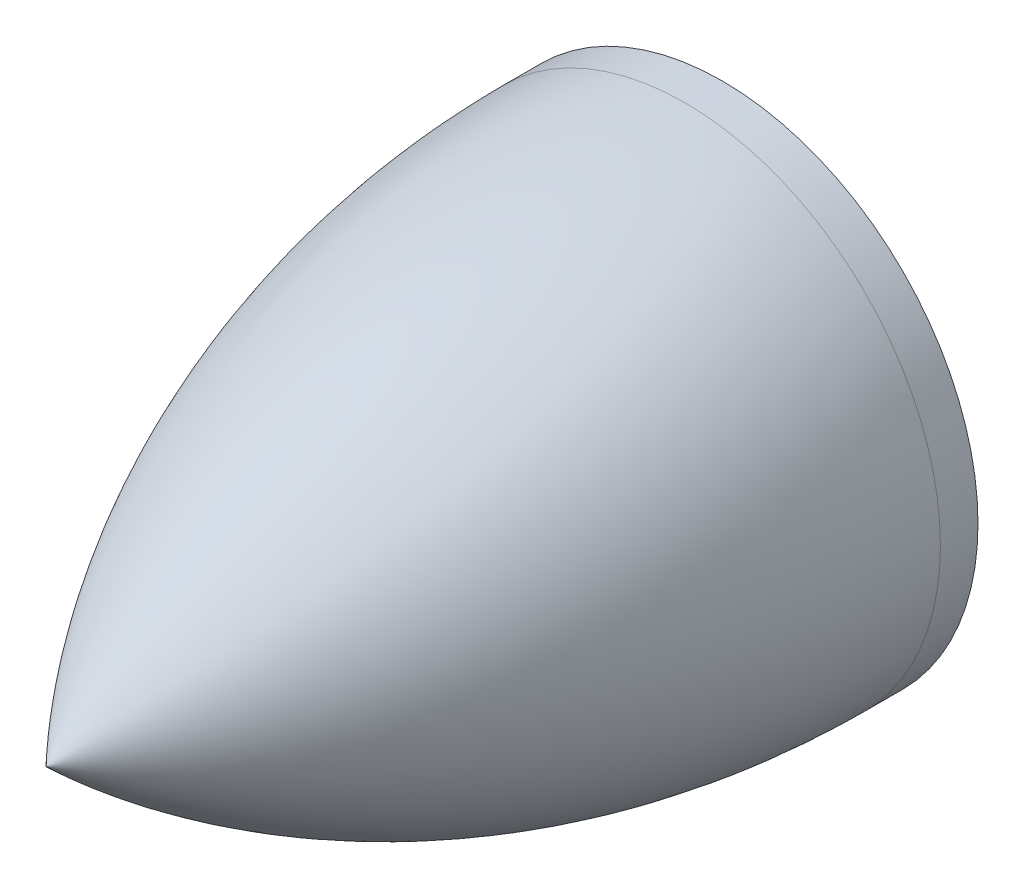
ISO-10303-21;
HEADER;
FILE_DESCRIPTION(('STEP AP214'),'2;1');
FILE_NAME('part.step','',(''),(''),'','','');
FILE_SCHEMA(('AUTOMOTIVE_DESIGN { 1 0 10303 214 1 1 1 1 }'));
ENDSEC;
DATA;
#1=APPLICATION_CONTEXT('core data for automotive mechanical design processes');
#2=APPLICATION_PROTOCOL_DEFINITION('international standard','automotive_design',2000,#1);
#3=PRODUCT_CONTEXT('',#1,'mechanical');
#4=PRODUCT('Part','Part','',(#3));
#5=PRODUCT_RELATED_PRODUCT_CATEGORY('part','',(#4));
#6=PRODUCT_DEFINITION_FORMATION('','',#4);
#7=PRODUCT_DEFINITION_CONTEXT('part definition',#1,'design');
#8=PRODUCT_DEFINITION('design','',#6,#7);
#9=PRODUCT_DEFINITION_SHAPE('','',#8);
#10=(LENGTH_UNIT() NAMED_UNIT(*) SI_UNIT(.MILLI.,.METRE.));
#11=(NAMED_UNIT(*) PLANE_ANGLE_UNIT() SI_UNIT($,.RADIAN.));
#12=(NAMED_UNIT(*) SI_UNIT($,.STERADIAN.) SOLID_ANGLE_UNIT());
#13=UNCERTAINTY_MEASURE_WITH_UNIT(LENGTH_MEASURE(1.E-05),#10,'distance_accuracy_value','');
#14=(GEOMETRIC_REPRESENTATION_CONTEXT(3) GLOBAL_UNCERTAINTY_ASSIGNED_CONTEXT((#13)) GLOBAL_UNIT_ASSIGNED_CONTEXT((#10,
#11,#12)) REPRESENTATION_CONTEXT('',''));
#15=CARTESIAN_POINT('',(0.,0.,0.));
#16=DIRECTION('',(0.,0.,1.));
#17=DIRECTION('',(1.,0.,0.));
#18=AXIS2_PLACEMENT_3D('',#15,#16,#17);
#19=CARTESIAN_POINT('',(-178.5,178.5,0.));
#20=DIRECTION('',(0.,-1.,0.));
#21=DIRECTION('',(1.,0.,0.));
#22=AXIS2_PLACEMENT_3D('',#19,#20,#21);
#23=CIRCLE('',#22,241.5);
#24=TRIMMED_CURVE('',#23,(PARAMETER_VALUE(-0.739017879013918)),
(PARAMETER_VALUE(0.739017879013918)),.T.,.PARAMETER.);
#25=CARTESIAN_POINT('',(0.,178.5,0.));
#26=DIRECTION('',(0.,0.,1.));
#27=AXIS1_PLACEMENT('',#25,#26);
#28=SURFACE_OF_REVOLUTION('',#24,#27);
#29=CARTESIAN_POINT('',(0.,178.5,162.665300540712));
#30=VERTEX_POINT('',#29);
#31=VERTEX_LOOP('',#30);
#32=FACE_BOUND('',#31,.T.);
#33=CARTESIAN_POINT('',(0.,178.5,0.));
#34=DIRECTION('',(0.,0.,1.));
#35=DIRECTION('',(1.,0.,0.));
#36=AXIS2_PLACEMENT_3D('',#33,#34,#35);
#37=CIRCLE('',#36,63.);
#38=CARTESIAN_POINT('',(63.,178.5,0.));
#39=VERTEX_POINT('',#38);
#40=EDGE_CURVE('E12',#39,#39,#37,.T.);
#41=ORIENTED_EDGE('',*,*,#40,.F.);
#42=EDGE_LOOP('',(#41));
#43=FACE_BOUND('',#42,.T.);
#44=ADVANCED_FACE('F44',(#32,#43),#28,.F.);
#45=CARTESIAN_POINT('',(0.,0.,0.));
#46=DIRECTION('',(0.,0.,1.));
#47=DIRECTION('',(1.,0.,0.));
#48=AXIS2_PLACEMENT_3D('',#45,#46,#47);
#49=PLANE('',#48);
#50=CARTESIAN_POINT('',(-3.88578058618805E-13,178.500000000004,0.));
#51=DIRECTION('',(0.,0.,-0.999999999999975));
#52=DIRECTION('',(-1.00000000000001,0.,0.));
#53=AXIS2_PLACEMENT_3D('',#50,#51,#52);
#54=CIRCLE('',#53,66.25);
#55=CARTESIAN_POINT('',(66.2499999999996,178.500000000004,0.));
#56=VERTEX_POINT('',#55);
#57=EDGE_CURVE('E67',#56,#56,#54,.T.);
#58=ORIENTED_EDGE('',*,*,#57,.T.);
#59=EDGE_LOOP('',(#58));
#60=FACE_BOUND('',#59,.T.);
#61=ORIENTED_EDGE('',*,*,#40,.T.);
#62=EDGE_LOOP('',(#61));
#63=FACE_BOUND('',#62,.T.);
#64=ADVANCED_FACE('F87',(#60,#63),#49,.F.);
#65=CARTESIAN_POINT('',(-3.88578058618805E-13,178.500000000004,-10.));
#66=DIRECTION('',(0.,0.,1.));
#67=DIRECTION('',(1.,0.,0.));
#68=AXIS2_PLACEMENT_3D('',#65,#66,#67);
#69=CYLINDRICAL_SURFACE('',#68,66.25);
#70=CARTESIAN_POINT('',(-3.88578058618805E-13,178.500000000004,-10.));
#71=DIRECTION('',(0.,0.,-0.999999999999975));
#72=DIRECTION('',(-1.00000000000001,0.,0.));
#73=AXIS2_PLACEMENT_3D('',#70,#71,#72);
#74=CIRCLE('',#73,66.25);
#75=CARTESIAN_POINT('',(66.2499999999996,178.500000000004,-10.));
#76=VERTEX_POINT('',#75);
#77=EDGE_CURVE('E66',#76,#76,#74,.T.);
#78=CARTESIAN_POINT('',(66.2499999999996,178.500000000004,-10.));
#79=CARTESIAN_POINT('',(66.2499999999996,178.500000000004,-9.89583333333333));
#80=CARTESIAN_POINT('',(66.2499999999996,178.500000000004,-9.79166666666667));
#81=CARTESIAN_POINT('',(66.2499999999996,178.500000000004,-9.58333333333333));
#82=CARTESIAN_POINT('',(66.2499999999996,178.500000000004,-9.47916666666667));
#83=CARTESIAN_POINT('',(66.2499999999996,178.500000000004,-9.27083333333333));
#84=CARTESIAN_POINT('',(66.2499999999996,178.500000000004,-9.16666666666667));
#85=CARTESIAN_POINT('',(66.2499999999996,178.500000000004,-8.95833333333333));
#86=CARTESIAN_POINT('',(66.2499999999996,178.500000000004,-8.85416666666667));
#87=CARTESIAN_POINT('',(66.2499999999996,178.500000000004,-8.64583333333333));
#88=CARTESIAN_POINT('',(66.2499999999996,178.500000000004,-8.54166666666667));
#89=CARTESIAN_POINT('',(66.2499999999996,178.500000000004,-8.33333333333333));
#90=CARTESIAN_POINT('',(66.2499999999996,178.500000000004,-8.22916666666667));
#91=CARTESIAN_POINT('',(66.2499999999996,178.500000000004,-8.02083333333333));
#92=CARTESIAN_POINT('',(66.2499999999996,178.500000000004,-7.91666666666667));
#93=CARTESIAN_POINT('',(66.2499999999996,178.500000000004,-7.70833333333333));
#94=CARTESIAN_POINT('',(66.2499999999996,178.500000000004,-7.60416666666667));
#95=CARTESIAN_POINT('',(66.2499999999996,178.500000000004,-7.39583333333333));
#96=CARTESIAN_POINT('',(66.2499999999996,178.500000000004,-7.29166666666667));
#97=CARTESIAN_POINT('',(66.2499999999996,178.500000000004,-7.08333333333333));
#98=CARTESIAN_POINT('',(66.2499999999996,178.500000000004,-6.97916666666667));
#99=CARTESIAN_POINT('',(66.2499999999996,178.500000000004,-6.77083333333333));
#100=CARTESIAN_POINT('',(66.2499999999996,178.500000000004,-6.66666666666667));
#101=CARTESIAN_POINT('',(66.2499999999996,178.500000000004,-6.45833333333333));
#102=CARTESIAN_POINT('',(66.2499999999996,178.500000000004,-6.35416666666667));
#103=CARTESIAN_POINT('',(66.2499999999996,178.500000000004,-6.14583333333333));
#104=CARTESIAN_POINT('',(66.2499999999996,178.500000000004,-6.04166666666667));
#105=CARTESIAN_POINT('',(66.2499999999996,178.500000000004,-5.83333333333333));
#106=CARTESIAN_POINT('',(66.2499999999996,178.500000000004,-5.72916666666667));
#107=CARTESIAN_POINT('',(66.2499999999996,178.500000000004,-5.52083333333333));
#108=CARTESIAN_POINT('',(66.2499999999996,178.500000000004,-5.41666666666667));
#109=CARTESIAN_POINT('',(66.2499999999996,178.500000000004,-5.20833333333333));
#110=CARTESIAN_POINT('',(66.2499999999996,178.500000000004,-5.10416666666667));
#111=CARTESIAN_POINT('',(66.2499999999996,178.500000000004,-4.89583333333333));
#112=CARTESIAN_POINT('',(66.2499999999996,178.500000000004,-4.79166666666666));
#113=CARTESIAN_POINT('',(66.2499999999996,178.500000000004,-4.58333333333333));
#114=CARTESIAN_POINT('',(66.2499999999996,178.500000000004,-4.47916666666666));
#115=CARTESIAN_POINT('',(66.2499999999996,178.500000000004,-4.27083333333333));
#116=CARTESIAN_POINT('',(66.2499999999996,178.500000000004,-4.16666666666667));
#117=CARTESIAN_POINT('',(66.2499999999996,178.500000000004,-3.95833333333333));
#118=CARTESIAN_POINT('',(66.2499999999996,178.500000000004,-3.85416666666667));
#119=CARTESIAN_POINT('',(66.2499999999996,178.500000000004,-3.64583333333333));
#120=CARTESIAN_POINT('',(66.2499999999996,178.500000000004,-3.54166666666666));
#121=CARTESIAN_POINT('',(66.2499999999996,178.500000000004,-3.33333333333333));
#122=CARTESIAN_POINT('',(66.2499999999996,178.500000000004,-3.22916666666666));
#123=CARTESIAN_POINT('',(66.2499999999996,178.500000000004,-3.02083333333333));
#124=CARTESIAN_POINT('',(66.2499999999996,178.500000000004,-2.91666666666667));
#125=CARTESIAN_POINT('',(66.2499999999996,178.500000000004,-2.70833333333333));
#126=CARTESIAN_POINT('',(66.2499999999996,178.500000000004,-2.60416666666666));
#127=CARTESIAN_POINT('',(66.2499999999996,178.500000000004,-2.39583333333333));
#128=CARTESIAN_POINT('',(66.2499999999996,178.500000000004,-2.29166666666666));
#129=CARTESIAN_POINT('',(66.2499999999996,178.500000000004,-2.08333333333333));
#130=CARTESIAN_POINT('',(66.2499999999996,178.500000000004,-1.97916666666667));
#131=CARTESIAN_POINT('',(66.2499999999996,178.500000000004,-1.77083333333333));
#132=CARTESIAN_POINT('',(66.2499999999996,178.500000000004,-1.66666666666666));
#133=CARTESIAN_POINT('',(66.2499999999996,178.500000000004,-1.45833333333333));
#134=CARTESIAN_POINT('',(66.2499999999996,178.500000000004,-1.35416666666667));
#135=CARTESIAN_POINT('',(66.2499999999996,178.500000000004,-1.14583333333333));
#136=CARTESIAN_POINT('',(66.2499999999996,178.500000000004,-1.04166666666667));
#137=CARTESIAN_POINT('',(66.2499999999996,178.500000000004,-0.833333333333332));
#138=CARTESIAN_POINT('',(66.2499999999996,178.500000000004,-0.729166666666666));
#139=CARTESIAN_POINT('',(66.2499999999996,178.500000000004,-0.520833333333332));
#140=CARTESIAN_POINT('',(66.2499999999996,178.500000000004,-0.416666666666665));
#141=CARTESIAN_POINT('',(66.2499999999996,178.500000000004,-0.208333333333332));
#142=CARTESIAN_POINT('',(66.2499999999996,178.500000000004,-0.104166666666665));
#143=CARTESIAN_POINT('',(66.2499999999996,178.500000000004,0.));
#144=B_SPLINE_CURVE_WITH_KNOTS('',3,(#78,#79,#80,#81,#82,#83,#84,#85,#86,#87,#88,#89,#90,#91,
#92,#93,#94,#95,#96,#97,#98,#99,#100,#101,#102,#103,#104,#105,#106,#107,#108,#109,#110,#111,
#112,#113,#114,#115,#116,#117,#118,#119,#120,#121,#122,#123,#124,#125,#126,#127,#128,#129,#130,
#131,#132,#133,#134,#135,#136,#137,#138,#139,#140,#141,#142,#143),.UNSPECIFIED.,.F.,.F.,(4,2,2,
2,2,2,2,2,2,2,2,2,2,2,2,2,2,2,2,2,2,2,2,2,2,2,2,2,2,2,2,2,4),(0.,0.3125,0.625000000000001,
0.937500000000001,1.25,1.5625,1.875,2.1875,2.5,2.8125,3.125,3.4375,3.75,4.0625,4.375,4.6875,5.,
5.3125,5.625,5.9375,6.25,6.5625,6.875,7.1875,7.5,7.8125,8.125,8.4375,8.75,9.0625,9.375,9.6875,
10.),.UNSPECIFIED.);
#145=EDGE_CURVE('BSEAM79',#76,#56,#144,.T.);
#146=ORIENTED_EDGE('',*,*,#77,.T.);
#147=ORIENTED_EDGE('',*,*,#57,.F.);
#148=ORIENTED_EDGE('',*,*,#145,.T.);
#149=ORIENTED_EDGE('',*,*,#145,.F.);
#150=EDGE_LOOP('',(#146,#148,#147,#149));
#151=FACE_BOUND('',#150,.T.);
#152=ADVANCED_FACE('F79',(#151),#69,.F.);
#153=CARTESIAN_POINT('',(-3.88578058618805E-13,178.500000000004,-10.));
#154=DIRECTION('',(0.,0.,1.));
#155=DIRECTION('',(1.,0.,0.));
#156=AXIS2_PLACEMENT_3D('',#153,#154,#155);
#157=CYLINDRICAL_SURFACE('',#156,68.);
#158=CARTESIAN_POINT('',(-3.88578058618805E-13,178.500000000004,-10.));
#159=DIRECTION('',(0.,0.,-0.999999999999975));
#160=DIRECTION('',(-1.00000000000001,0.,0.));
#161=AXIS2_PLACEMENT_3D('',#158,#159,#160);
#162=CIRCLE('',#161,68.);
#163=CARTESIAN_POINT('',(67.9999999999996,178.500000000004,-10.));
#164=VERTEX_POINT('',#163);
#165=EDGE_CURVE('E51',#164,#164,#162,.T.);
#166=CARTESIAN_POINT('',(-3.88578058618805E-13,178.500000000004,0.));
#167=DIRECTION('',(0.,0.,-0.999999999999975));
#168=DIRECTION('',(-1.00000000000001,0.,0.));
#169=AXIS2_PLACEMENT_3D('',#166,#167,#168);
#170=CIRCLE('',#169,68.);
#171=CARTESIAN_POINT('',(67.9999999999996,178.500000000004,0.));
#172=VERTEX_POINT('',#171);
#173=EDGE_CURVE('E64',#172,#172,#170,.T.);
#174=CARTESIAN_POINT('',(67.9999999999996,178.500000000004,-10.));
#175=CARTESIAN_POINT('',(67.9999999999996,178.500000000004,-9.89583333333333));
#176=CARTESIAN_POINT('',(67.9999999999996,178.500000000004,-9.79166666666667));
#177=CARTESIAN_POINT('',(67.9999999999996,178.500000000004,-9.58333333333333));
#178=CARTESIAN_POINT('',(67.9999999999996,178.500000000004,-9.47916666666667));
#179=CARTESIAN_POINT('',(67.9999999999996,178.500000000004,-9.27083333333333));
#180=CARTESIAN_POINT('',(67.9999999999996,178.500000000004,-9.16666666666667));
#181=CARTESIAN_POINT('',(67.9999999999996,178.500000000004,-8.95833333333333));
#182=CARTESIAN_POINT('',(67.9999999999996,178.500000000004,-8.85416666666667));
#183=CARTESIAN_POINT('',(67.9999999999996,178.500000000004,-8.64583333333333));
#184=CARTESIAN_POINT('',(67.9999999999996,178.500000000004,-8.54166666666667));
#185=CARTESIAN_POINT('',(67.9999999999996,178.500000000004,-8.33333333333333));
#186=CARTESIAN_POINT('',(67.9999999999996,178.500000000004,-8.22916666666667));
#187=CARTESIAN_POINT('',(67.9999999999996,178.500000000004,-8.02083333333333));
#188=CARTESIAN_POINT('',(67.9999999999996,178.500000000004,-7.91666666666667));
#189=CARTESIAN_POINT('',(67.9999999999996,178.500000000004,-7.70833333333333));
#190=CARTESIAN_POINT('',(67.9999999999996,178.500000000004,-7.60416666666667));
#191=CARTESIAN_POINT('',(67.9999999999996,178.500000000004,-7.39583333333333));
#192=CARTESIAN_POINT('',(67.9999999999996,178.500000000004,-7.29166666666667));
#193=CARTESIAN_POINT('',(67.9999999999996,178.500000000004,-7.08333333333333));
#194=CARTESIAN_POINT('',(67.9999999999996,178.500000000004,-6.97916666666667));
#195=CARTESIAN_POINT('',(67.9999999999996,178.500000000004,-6.77083333333333));
#196=CARTESIAN_POINT('',(67.9999999999996,178.500000000004,-6.66666666666667));
#197=CARTESIAN_POINT('',(67.9999999999996,178.500000000004,-6.45833333333333));
#198=CARTESIAN_POINT('',(67.9999999999996,178.500000000004,-6.35416666666667));
#199=CARTESIAN_POINT('',(67.9999999999996,178.500000000004,-6.14583333333333));
#200=CARTESIAN_POINT('',(67.9999999999996,178.500000000004,-6.04166666666667));
#201=CARTESIAN_POINT('',(67.9999999999996,178.500000000004,-5.83333333333333));
#202=CARTESIAN_POINT('',(67.9999999999996,178.500000000004,-5.72916666666667));
#203=CARTESIAN_POINT('',(67.9999999999996,178.500000000004,-5.52083333333333));
#204=CARTESIAN_POINT('',(67.9999999999996,178.500000000004,-5.41666666666667));
#205=CARTESIAN_POINT('',(67.9999999999996,178.500000000004,-5.20833333333333));
#206=CARTESIAN_POINT('',(67.9999999999996,178.500000000004,-5.10416666666667));
#207=CARTESIAN_POINT('',(67.9999999999996,178.500000000004,-4.89583333333333));
#208=CARTESIAN_POINT('',(67.9999999999996,178.500000000004,-4.79166666666666));
#209=CARTESIAN_POINT('',(67.9999999999996,178.500000000004,-4.58333333333333));
#210=CARTESIAN_POINT('',(67.9999999999996,178.500000000004,-4.47916666666666));
#211=CARTESIAN_POINT('',(67.9999999999996,178.500000000004,-4.27083333333333));
#212=CARTESIAN_POINT('',(67.9999999999996,178.500000000004,-4.16666666666667));
#213=CARTESIAN_POINT('',(67.9999999999996,178.500000000004,-3.95833333333333));
#214=CARTESIAN_POINT('',(67.9999999999996,178.500000000004,-3.85416666666667));
#215=CARTESIAN_POINT('',(67.9999999999996,178.500000000004,-3.64583333333333));
#216=CARTESIAN_POINT('',(67.9999999999996,178.500000000004,-3.54166666666666));
#217=CARTESIAN_POINT('',(67.9999999999996,178.500000000004,-3.33333333333333));
#218=CARTESIAN_POINT('',(67.9999999999996,178.500000000004,-3.22916666666666));
#219=CARTESIAN_POINT('',(67.9999999999996,178.500000000004,-3.02083333333333));
#220=CARTESIAN_POINT('',(67.9999999999996,178.500000000004,-2.91666666666667));
#221=CARTESIAN_POINT('',(67.9999999999996,178.500000000004,-2.70833333333333));
#222=CARTESIAN_POINT('',(67.9999999999996,178.500000000004,-2.60416666666666));
#223=CARTESIAN_POINT('',(67.9999999999996,178.500000000004,-2.39583333333333));
#224=CARTESIAN_POINT('',(67.9999999999996,178.500000000004,-2.29166666666666));
#225=CARTESIAN_POINT('',(67.9999999999996,178.500000000004,-2.08333333333333));
#226=CARTESIAN_POINT('',(67.9999999999996,178.500000000004,-1.97916666666667));
#227=CARTESIAN_POINT('',(67.9999999999996,178.500000000004,-1.77083333333333));
#228=CARTESIAN_POINT('',(67.9999999999996,178.500000000004,-1.66666666666666));
#229=CARTESIAN_POINT('',(67.9999999999996,178.500000000004,-1.45833333333333));
#230=CARTESIAN_POINT('',(67.9999999999996,178.500000000004,-1.35416666666667));
#231=CARTESIAN_POINT('',(67.9999999999996,178.500000000004,-1.14583333333333));
#232=CARTESIAN_POINT('',(67.9999999999996,178.500000000004,-1.04166666666667));
#233=CARTESIAN_POINT('',(67.9999999999996,178.500000000004,-0.833333333333332));
#234=CARTESIAN_POINT('',(67.9999999999996,178.500000000004,-0.729166666666666));
#235=CARTESIAN_POINT('',(67.9999999999996,178.500000000004,-0.520833333333332));
#236=CARTESIAN_POINT('',(67.9999999999996,178.500000000004,-0.416666666666665));
#237=CARTESIAN_POINT('',(67.9999999999996,178.500000000004,-0.208333333333332));
#238=CARTESIAN_POINT('',(67.9999999999996,178.500000000004,-0.104166666666665));
#239=CARTESIAN_POINT('',(67.9999999999996,178.500000000004,0.));
#240=B_SPLINE_CURVE_WITH_KNOTS('',3,(#174,#175,#176,#177,#178,#179,#180,#181,#182,#183,#184,
#185,#186,#187,#188,#189,#190,#191,#192,#193,#194,#195,#196,#197,#198,#199,#200,#201,#202,#203,
#204,#205,#206,#207,#208,#209,#210,#211,#212,#213,#214,#215,#216,#217,#218,#219,#220,#221,#222,
#223,#224,#225,#226,#227,#228,#229,#230,#231,#232,#233,#234,#235,#236,#237,#238,#239),
.UNSPECIFIED.,.F.,.F.,(4,2,2,2,2,2,2,2,2,2,2,2,2,2,2,2,2,2,2,2,2,2,2,2,2,2,2,2,2,2,2,2,4),(0.,
0.3125,0.625000000000001,0.937500000000001,1.25,1.5625,1.875,2.1875,2.5,2.8125,3.125,3.4375,
3.75,4.0625,4.375,4.6875,5.,5.3125,5.625,5.9375,6.25,6.5625,6.875,7.1875,7.5,7.8125,8.125,
8.4375,8.75,9.0625,9.375,9.6875,10.),.UNSPECIFIED.);
#241=EDGE_CURVE('BSEAM77',#164,#172,#240,.T.);
#242=ORIENTED_EDGE('',*,*,#165,.F.);
#243=ORIENTED_EDGE('',*,*,#173,.T.);
#244=ORIENTED_EDGE('',*,*,#241,.T.);
#245=ORIENTED_EDGE('',*,*,#241,.F.);
#246=EDGE_LOOP('',(#242,#244,#243,#245));
#247=FACE_BOUND('',#246,.T.);
#248=ADVANCED_FACE('F77',(#247),#157,.T.);
#249=CARTESIAN_POINT('',(0.,0.,-10.));
#250=DIRECTION('',(0.,0.,-0.999999999999975));
#251=DIRECTION('',(-1.00000000000001,0.,0.));
#252=AXIS2_PLACEMENT_3D('',#249,#250,#251);
#253=PLANE('',#252);
#254=ORIENTED_EDGE('',*,*,#77,.F.);
#255=EDGE_LOOP('',(#254));
#256=FACE_BOUND('',#255,.T.);
#257=ORIENTED_EDGE('',*,*,#165,.T.);
#258=EDGE_LOOP('',(#257));
#259=FACE_BOUND('',#258,.T.);
#260=ADVANCED_FACE('F60',(#256,#259),#253,.T.);
#261=CARTESIAN_POINT('',(-178.5,178.5,0.));
#262=DIRECTION('',(0.,-1.,0.));
#263=DIRECTION('',(1.,0.,0.));
#264=AXIS2_PLACEMENT_3D('',#261,#262,#263);
#265=CIRCLE('',#264,246.5);
#266=TRIMMED_CURVE('',#265,(PARAMETER_VALUE(-0.76101275422473)),
(PARAMETER_VALUE(0.76101275422473)),.T.,.PARAMETER.);
#267=CARTESIAN_POINT('',(0.,178.5,0.));
#268=DIRECTION('',(0.,0.,1.));
#269=AXIS1_PLACEMENT('',#267,#268);
#270=SURFACE_OF_REVOLUTION('',#266,#269);
#271=CARTESIAN_POINT('',(0.,178.5,170.));
#272=VERTEX_POINT('',#271);
#273=VERTEX_LOOP('',#272);
#274=FACE_BOUND('',#273,.T.);
#275=ORIENTED_EDGE('',*,*,#173,.F.);
#276=EDGE_LOOP('',(#275));
#277=FACE_BOUND('',#276,.T.);
#278=ADVANCED_FACE('F57',(#274,#277),#270,.T.);
#279=CLOSED_SHELL('',(#44,#64,#152,#248,#260,#278));
#280=MANIFOLD_SOLID_BREP('B2',#279);
#281=ADVANCED_BREP_SHAPE_REPRESENTATION('',(#18,#280),#14);
#282=SHAPE_DEFINITION_REPRESENTATION(#9,#281);
ENDSEC;
END-ISO-10303-21;
